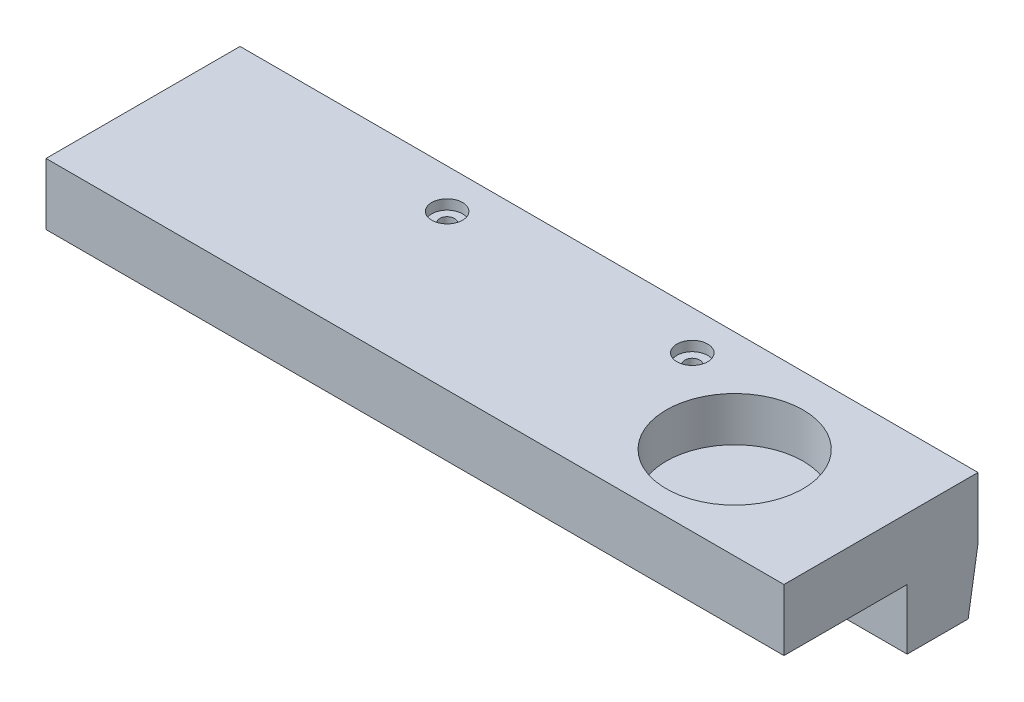
ISO-10303-21;
HEADER;
FILE_DESCRIPTION(('STEP AP214'),'2;1');
FILE_NAME('part.step','',(''),(''),'','','');
FILE_SCHEMA(('AUTOMOTIVE_DESIGN { 1 0 10303 214 1 1 1 1 }'));
ENDSEC;
DATA;
#1=APPLICATION_CONTEXT('core data for automotive mechanical design processes');
#2=APPLICATION_PROTOCOL_DEFINITION('international standard','automotive_design',2000,#1);
#3=PRODUCT_CONTEXT('',#1,'mechanical');
#4=PRODUCT('Part','Part','',(#3));
#5=PRODUCT_RELATED_PRODUCT_CATEGORY('part','',(#4));
#6=PRODUCT_DEFINITION_FORMATION('','',#4);
#7=PRODUCT_DEFINITION_CONTEXT('part definition',#1,'design');
#8=PRODUCT_DEFINITION('design','',#6,#7);
#9=PRODUCT_DEFINITION_SHAPE('','',#8);
#10=(LENGTH_UNIT() NAMED_UNIT(*) SI_UNIT(.MILLI.,.METRE.));
#11=(NAMED_UNIT(*) PLANE_ANGLE_UNIT() SI_UNIT($,.RADIAN.));
#12=(NAMED_UNIT(*) SI_UNIT($,.STERADIAN.) SOLID_ANGLE_UNIT());
#13=UNCERTAINTY_MEASURE_WITH_UNIT(LENGTH_MEASURE(1.E-05),#10,'distance_accuracy_value','');
#14=(GEOMETRIC_REPRESENTATION_CONTEXT(3) GLOBAL_UNCERTAINTY_ASSIGNED_CONTEXT((#13)) GLOBAL_UNIT_ASSIGNED_CONTEXT((#10,
#11,#12)) REPRESENTATION_CONTEXT('',''));
#15=CARTESIAN_POINT('',(0.,0.,0.));
#16=DIRECTION('',(0.,0.,1.));
#17=DIRECTION('',(1.,0.,0.));
#18=AXIS2_PLACEMENT_3D('',#15,#16,#17);
#19=CARTESIAN_POINT('',(-58.3066322296311,-28.9751506024097,30.));
#20=DIRECTION('',(0.,-1.,0.));
#21=DIRECTION('',(0.,0.,1.));
#22=AXIS2_PLACEMENT_3D('',#19,#20,#21);
#23=PLANE('',#22);
#24=DIRECTION('',(1.,0.,0.));
#25=VECTOR('',#24,1.);
#26=CARTESIAN_POINT('',(-58.3066322296311,-28.9751506024097,10.));
#27=LINE('',#26,#25);
#28=CARTESIAN_POINT('',(-58.3066322296311,-28.9751506024097,10.));
#29=VERTEX_POINT('',#28);
#30=CARTESIAN_POINT('',(61.4933677703689,-28.9751506024097,10.));
#31=VERTEX_POINT('',#30);
#32=EDGE_CURVE('E146',#29,#31,#27,.T.);
#33=ORIENTED_EDGE('',*,*,#32,.T.);
#34=DIRECTION('',(0.,0.,-1.));
#35=VECTOR('',#34,1.);
#36=CARTESIAN_POINT('',(61.4933677703689,-28.9751506024097,30.));
#37=LINE('',#36,#35);
#38=CARTESIAN_POINT('',(61.4933677703689,-28.9751506024097,30.));
#39=VERTEX_POINT('',#38);
#40=EDGE_CURVE('E127',#39,#31,#37,.T.);
#41=ORIENTED_EDGE('',*,*,#40,.F.);
#42=DIRECTION('',(1.,0.,0.));
#43=VECTOR('',#42,1.);
#44=CARTESIAN_POINT('',(-58.3066322296311,-28.9751506024097,30.));
#45=LINE('',#44,#43);
#46=CARTESIAN_POINT('',(-58.3066322296311,-28.9751506024097,30.));
#47=VERTEX_POINT('',#46);
#48=EDGE_CURVE('E139',#47,#39,#45,.T.);
#49=ORIENTED_EDGE('',*,*,#48,.F.);
#50=DIRECTION('',(0.,0.,-1.));
#51=VECTOR('',#50,1.);
#52=CARTESIAN_POINT('',(-58.3066322296311,-28.9751506024097,30.));
#53=LINE('',#52,#51);
#54=EDGE_CURVE('E52',#47,#29,#53,.T.);
#55=ORIENTED_EDGE('',*,*,#54,.T.);
#56=EDGE_LOOP('',(#33,#41,#49,#55));
#57=FACE_BOUND('',#56,.T.);
#58=ADVANCED_FACE('F45',(#57),#23,.T.);
#59=CARTESIAN_POINT('',(-58.3066322296311,-28.9751506024097,30.));
#60=DIRECTION('',(1.,0.,0.));
#61=DIRECTION('',(0.,-1.,0.));
#62=AXIS2_PLACEMENT_3D('',#59,#60,#61);
#63=PLANE('',#62);
#64=DIRECTION('',(0.,-1.,0.));
#65=VECTOR('',#64,1.);
#66=CARTESIAN_POINT('',(-58.3066322296311,-28.9751506024097,-1.5));
#67=LINE('',#66,#65);
#68=CARTESIAN_POINT('',(-58.3066322296311,-18.9751506024097,-1.5));
#69=VERTEX_POINT('',#68);
#70=CARTESIAN_POINT('',(-58.3066322296311,-28.9751506024097,-1.5));
#71=VERTEX_POINT('',#70);
#72=EDGE_CURVE('E119',#69,#71,#67,.T.);
#73=ORIENTED_EDGE('',*,*,#72,.T.);
#74=DIRECTION('',(0.,0.986989017415999,-0.160787684541453));
#75=VECTOR('',#74,1.);
#76=CARTESIAN_POINT('',(-58.3066322296311,-33.9740644839218,-0.685640595743636));
#77=LINE('',#76,#75);
#78=CARTESIAN_POINT('',(-58.3066322296311,-38.7751506024097,0.0964912280701766));
#79=VERTEX_POINT('',#78);
#80=EDGE_CURVE('E182',#79,#71,#77,.T.);
#81=ORIENTED_EDGE('',*,*,#80,.F.);
#82=DIRECTION('',(0.,0.,1.));
#83=VECTOR('',#82,1.);
#84=CARTESIAN_POINT('',(-58.3066322296311,-38.7751506024097,0.));
#85=LINE('',#84,#83);
#86=CARTESIAN_POINT('',(-58.3066322296311,-38.7751506024097,10.));
#87=VERTEX_POINT('',#86);
#88=EDGE_CURVE('E149',#79,#87,#85,.T.);
#89=ORIENTED_EDGE('',*,*,#88,.T.);
#90=DIRECTION('',(0.,1.,0.));
#91=VECTOR('',#90,1.);
#92=CARTESIAN_POINT('',(-58.3066322296311,-38.7751506024097,10.));
#93=LINE('',#92,#91);
#94=EDGE_CURVE('E65',#87,#29,#93,.T.);
#95=ORIENTED_EDGE('',*,*,#94,.T.);
#96=ORIENTED_EDGE('',*,*,#54,.F.);
#97=DIRECTION('',(0.,1.,0.));
#98=VECTOR('',#97,1.);
#99=CARTESIAN_POINT('',(-58.3066322296311,-28.9751506024097,30.));
#100=LINE('',#99,#98);
#101=CARTESIAN_POINT('',(-58.3066322296311,-18.9751506024097,30.));
#102=VERTEX_POINT('',#101);
#103=EDGE_CURVE('E131',#47,#102,#100,.T.);
#104=ORIENTED_EDGE('',*,*,#103,.T.);
#105=DIRECTION('',(0.,0.,-1.));
#106=VECTOR('',#105,1.);
#107=CARTESIAN_POINT('',(-58.3066322296311,-18.9751506024097,30.));
#108=LINE('',#107,#106);
#109=EDGE_CURVE('E126',#102,#69,#108,.T.);
#110=ORIENTED_EDGE('',*,*,#109,.T.);
#111=EDGE_LOOP('',(#73,#81,#89,#95,#96,#104,#110));
#112=FACE_BOUND('',#111,.T.);
#113=ADVANCED_FACE('F190',(#112),#63,.F.);
#114=CARTESIAN_POINT('',(-58.3066322296311,-18.9751506024097,30.));
#115=DIRECTION('',(0.,-1.,0.));
#116=DIRECTION('',(0.,0.,1.));
#117=AXIS2_PLACEMENT_3D('',#114,#115,#116);
#118=PLANE('',#117);
#119=CARTESIAN_POINT('',(38.4933677703689,-18.9751506024097,15.));
#120=DIRECTION('',(0.,-1.,0.));
#121=DIRECTION('',(0.,0.,-1.));
#122=AXIS2_PLACEMENT_3D('',#119,#120,#121);
#123=CIRCLE('',#122,11.1);
#124=CARTESIAN_POINT('',(38.4933677703689,-18.9751506024097,3.9));
#125=VERTEX_POINT('',#124);
#126=EDGE_CURVE('E179',#125,#125,#123,.T.);
#127=ORIENTED_EDGE('',*,*,#126,.T.);
#128=EDGE_LOOP('',(#127));
#129=FACE_BOUND('',#128,.T.);
#130=CARTESIAN_POINT('',(21.4933677703689,-18.9751506024097,4.88));
#131=DIRECTION('',(0.,-1.,0.));
#132=DIRECTION('',(0.,0.,-1.));
#133=AXIS2_PLACEMENT_3D('',#130,#131,#132);
#134=CIRCLE('',#133,2.5);
#135=CARTESIAN_POINT('',(21.4933677703689,-18.9751506024097,2.38));
#136=VERTEX_POINT('',#135);
#137=EDGE_CURVE('E175',#136,#136,#134,.T.);
#138=ORIENTED_EDGE('',*,*,#137,.T.);
#139=EDGE_LOOP('',(#138));
#140=FACE_BOUND('',#139,.T.);
#141=CARTESIAN_POINT('',(-18.3066322296311,-18.9751506024097,4.88));
#142=DIRECTION('',(0.,-1.,0.));
#143=DIRECTION('',(0.,0.,-1.));
#144=AXIS2_PLACEMENT_3D('',#141,#142,#143);
#145=CIRCLE('',#144,2.5);
#146=CARTESIAN_POINT('',(-18.3066322296311,-18.9751506024097,2.38000000000001));
#147=VERTEX_POINT('',#146);
#148=EDGE_CURVE('E163',#147,#147,#145,.T.);
#149=ORIENTED_EDGE('',*,*,#148,.T.);
#150=EDGE_LOOP('',(#149));
#151=FACE_BOUND('',#150,.T.);
#152=ORIENTED_EDGE('',*,*,#109,.F.);
#153=DIRECTION('',(1.,0.,0.));
#154=VECTOR('',#153,1.);
#155=CARTESIAN_POINT('',(-58.3066322296311,-18.9751506024097,30.));
#156=LINE('',#155,#154);
#157=CARTESIAN_POINT('',(61.4933677703689,-18.9751506024097,30.));
#158=VERTEX_POINT('',#157);
#159=EDGE_CURVE('E125',#102,#158,#156,.T.);
#160=ORIENTED_EDGE('',*,*,#159,.T.);
#161=DIRECTION('',(0.,0.,-1.));
#162=VECTOR('',#161,1.);
#163=CARTESIAN_POINT('',(61.4933677703689,-18.9751506024097,30.));
#164=LINE('',#163,#162);
#165=CARTESIAN_POINT('',(61.4933677703689,-18.9751506024097,-1.5));
#166=VERTEX_POINT('',#165);
#167=EDGE_CURVE('E109',#158,#166,#164,.T.);
#168=ORIENTED_EDGE('',*,*,#167,.T.);
#169=DIRECTION('',(-1.,0.,0.));
#170=VECTOR('',#169,1.);
#171=CARTESIAN_POINT('',(61.4933677703689,-18.9751506024097,-1.5));
#172=LINE('',#171,#170);
#173=EDGE_CURVE('E114',#166,#69,#172,.T.);
#174=ORIENTED_EDGE('',*,*,#173,.T.);
#175=EDGE_LOOP('',(#152,#160,#168,#174));
#176=FACE_BOUND('',#175,.T.);
#177=ADVANCED_FACE('F124',(#129,#140,#151,#176),#118,.F.);
#178=CARTESIAN_POINT('',(61.4933677703689,-28.9751506024097,30.));
#179=DIRECTION('',(1.,0.,0.));
#180=DIRECTION('',(0.,0.,-1.));
#181=AXIS2_PLACEMENT_3D('',#178,#179,#180);
#182=PLANE('',#181);
#183=ORIENTED_EDGE('',*,*,#167,.F.);
#184=DIRECTION('',(0.,1.,0.));
#185=VECTOR('',#184,1.);
#186=CARTESIAN_POINT('',(61.4933677703689,-28.9751506024097,30.));
#187=LINE('',#186,#185);
#188=EDGE_CURVE('E137',#39,#158,#187,.T.);
#189=ORIENTED_EDGE('',*,*,#188,.F.);
#190=ORIENTED_EDGE('',*,*,#40,.T.);
#191=DIRECTION('',(0.,1.,0.));
#192=VECTOR('',#191,1.);
#193=CARTESIAN_POINT('',(61.4933677703689,-38.7751506024097,10.));
#194=LINE('',#193,#192);
#195=CARTESIAN_POINT('',(61.4933677703689,-38.7751506024097,10.));
#196=VERTEX_POINT('',#195);
#197=EDGE_CURVE('E143',#196,#31,#194,.T.);
#198=ORIENTED_EDGE('',*,*,#197,.F.);
#199=DIRECTION('',(0.,0.,-1.));
#200=VECTOR('',#199,1.);
#201=CARTESIAN_POINT('',(61.4933677703689,-38.7751506024097,0.));
#202=LINE('',#201,#200);
#203=CARTESIAN_POINT('',(61.4933677703689,-38.7751506024097,0.0964912280701786));
#204=VERTEX_POINT('',#203);
#205=EDGE_CURVE('E145',#196,#204,#202,.T.);
#206=ORIENTED_EDGE('',*,*,#205,.T.);
#207=DIRECTION('',(0.,0.986989017415999,-0.160787684541453));
#208=VECTOR('',#207,1.);
#209=CARTESIAN_POINT('',(61.4933677703689,1.98372710949531,-6.54342619366873));
#210=LINE('',#209,#208);
#211=CARTESIAN_POINT('',(61.4933677703689,-28.9751506024097,-1.5));
#212=VERTEX_POINT('',#211);
#213=EDGE_CURVE('E112',#204,#212,#210,.T.);
#214=ORIENTED_EDGE('',*,*,#213,.T.);
#215=DIRECTION('',(0.,1.,0.));
#216=VECTOR('',#215,1.);
#217=CARTESIAN_POINT('',(61.4933677703689,-28.9751506024097,-1.5));
#218=LINE('',#217,#216);
#219=EDGE_CURVE('E105',#212,#166,#218,.T.);
#220=ORIENTED_EDGE('',*,*,#219,.T.);
#221=EDGE_LOOP('',(#183,#189,#190,#198,#206,#214,#220));
#222=FACE_BOUND('',#221,.T.);
#223=ADVANCED_FACE('F107',(#222),#182,.T.);
#224=CARTESIAN_POINT('',(0.,3.0496987951807,30.));
#225=DIRECTION('',(0.,0.,-1.));
#226=DIRECTION('',(-1.,0.,0.));
#227=AXIS2_PLACEMENT_3D('',#224,#225,#226);
#228=PLANE('',#227);
#229=ORIENTED_EDGE('',*,*,#48,.T.);
#230=ORIENTED_EDGE('',*,*,#188,.T.);
#231=ORIENTED_EDGE('',*,*,#159,.F.);
#232=ORIENTED_EDGE('',*,*,#103,.F.);
#233=EDGE_LOOP('',(#229,#230,#231,#232));
#234=FACE_BOUND('',#233,.T.);
#235=ADVANCED_FACE('F193',(#234),#228,.F.);
#236=CARTESIAN_POINT('',(-58.3066322296311,-38.7751506024097,10.));
#237=DIRECTION('',(0.,0.,-1.));
#238=DIRECTION('',(-1.,0.,0.));
#239=AXIS2_PLACEMENT_3D('',#236,#237,#238);
#240=PLANE('',#239);
#241=ORIENTED_EDGE('',*,*,#32,.F.);
#242=ORIENTED_EDGE('',*,*,#94,.F.);
#243=DIRECTION('',(1.,0.,0.));
#244=VECTOR('',#243,1.);
#245=CARTESIAN_POINT('',(-58.3066322296311,-38.7751506024097,10.));
#246=LINE('',#245,#244);
#247=EDGE_CURVE('E152',#87,#196,#246,.T.);
#248=ORIENTED_EDGE('',*,*,#247,.T.);
#249=ORIENTED_EDGE('',*,*,#197,.T.);
#250=EDGE_LOOP('',(#241,#242,#248,#249));
#251=FACE_BOUND('',#250,.T.);
#252=ADVANCED_FACE('F199',(#251),#240,.F.);
#253=CARTESIAN_POINT('',(0.,-38.7751506024097,0.));
#254=DIRECTION('',(0.,-1.,0.));
#255=DIRECTION('',(0.,0.,1.));
#256=AXIS2_PLACEMENT_3D('',#253,#254,#255);
#257=PLANE('',#256);
#258=DIRECTION('',(1.,0.,0.));
#259=VECTOR('',#258,1.);
#260=CARTESIAN_POINT('',(0.,-38.7751506024097,0.0964912280701766));
#261=LINE('',#260,#259);
#262=EDGE_CURVE('E11',#79,#204,#261,.T.);
#263=ORIENTED_EDGE('',*,*,#262,.T.);
#264=ORIENTED_EDGE('',*,*,#205,.F.);
#265=ORIENTED_EDGE('',*,*,#247,.F.);
#266=ORIENTED_EDGE('',*,*,#88,.F.);
#267=EDGE_LOOP('',(#263,#264,#265,#266));
#268=FACE_BOUND('',#267,.T.);
#269=CARTESIAN_POINT('',(21.4933677703689,-38.7751506024097,4.88));
#270=DIRECTION('',(0.,-1.,0.));
#271=DIRECTION('',(0.,0.,-1.));
#272=AXIS2_PLACEMENT_3D('',#269,#270,#271);
#273=CIRCLE('',#272,1.19999999999999);
#274=CARTESIAN_POINT('',(21.4933677703689,-38.7751506024097,3.68000000000001));
#275=VERTEX_POINT('',#274);
#276=EDGE_CURVE('E166',#275,#275,#273,.T.);
#277=ORIENTED_EDGE('',*,*,#276,.F.);
#278=EDGE_LOOP('',(#277));
#279=FACE_BOUND('',#278,.T.);
#280=CARTESIAN_POINT('',(-18.3066322296311,-38.7751506024097,4.88));
#281=DIRECTION('',(0.,-1.,0.));
#282=DIRECTION('',(0.,0.,-1.));
#283=AXIS2_PLACEMENT_3D('',#280,#281,#282);
#284=CIRCLE('',#283,1.19999999999999);
#285=CARTESIAN_POINT('',(-18.3066322296311,-38.7751506024097,3.68000000000001));
#286=VERTEX_POINT('',#285);
#287=EDGE_CURVE('E150',#286,#286,#284,.T.);
#288=ORIENTED_EDGE('',*,*,#287,.F.);
#289=EDGE_LOOP('',(#288));
#290=FACE_BOUND('',#289,.T.);
#291=ADVANCED_FACE('F202',(#268,#279,#290),#257,.T.);
#292=CARTESIAN_POINT('',(-18.3066322296311,-18.9751506024097,4.88));
#293=DIRECTION('',(0.,1.,0.));
#294=DIRECTION('',(0.,0.,-1.));
#295=AXIS2_PLACEMENT_3D('',#292,#293,#294);
#296=CYLINDRICAL_SURFACE('',#295,1.2);
#297=ORIENTED_EDGE('',*,*,#287,.T.);
#298=EDGE_LOOP('',(#297));
#299=FACE_BOUND('',#298,.T.);
#300=CARTESIAN_POINT('',(-18.3066322296311,-20.5751506024097,4.88));
#301=DIRECTION('',(0.,-1.,0.));
#302=DIRECTION('',(0.,0.,-1.));
#303=AXIS2_PLACEMENT_3D('',#300,#301,#302);
#304=CIRCLE('',#303,1.20000000000001);
#305=CARTESIAN_POINT('',(-18.3066322296311,-20.5751506024097,3.67999999999999));
#306=VERTEX_POINT('',#305);
#307=EDGE_CURVE('E157',#306,#306,#304,.T.);
#308=ORIENTED_EDGE('',*,*,#307,.F.);
#309=EDGE_LOOP('',(#308));
#310=FACE_BOUND('',#309,.T.);
#311=ADVANCED_FACE('F238',(#299,#310),#296,.F.);
#312=CARTESIAN_POINT('',(-17.1066322296311,-20.5751506024097,4.88));
#313=DIRECTION('',(0.,-1.,0.));
#314=DIRECTION('',(0.,0.,1.));
#315=AXIS2_PLACEMENT_3D('',#312,#313,#314);
#316=PLANE('',#315);
#317=ORIENTED_EDGE('',*,*,#307,.T.);
#318=EDGE_LOOP('',(#317));
#319=FACE_BOUND('',#318,.T.);
#320=CARTESIAN_POINT('',(-18.3066322296311,-20.5751506024097,4.88));
#321=DIRECTION('',(0.,-1.,0.));
#322=DIRECTION('',(0.,0.,-1.));
#323=AXIS2_PLACEMENT_3D('',#320,#321,#322);
#324=CIRCLE('',#323,2.5);
#325=CARTESIAN_POINT('',(-18.3066322296311,-20.5751506024097,2.38000000000001));
#326=VERTEX_POINT('',#325);
#327=EDGE_CURVE('E160',#326,#326,#324,.T.);
#328=ORIENTED_EDGE('',*,*,#327,.F.);
#329=EDGE_LOOP('',(#328));
#330=FACE_BOUND('',#329,.T.);
#331=ADVANCED_FACE('F243',(#319,#330),#316,.F.);
#332=CARTESIAN_POINT('',(-18.3066322296311,-18.9751506024097,4.88));
#333=DIRECTION('',(0.,1.,0.));
#334=DIRECTION('',(0.,0.,-1.));
#335=AXIS2_PLACEMENT_3D('',#332,#333,#334);
#336=CYLINDRICAL_SURFACE('',#335,2.5);
#337=ORIENTED_EDGE('',*,*,#327,.T.);
#338=EDGE_LOOP('',(#337));
#339=FACE_BOUND('',#338,.T.);
#340=ORIENTED_EDGE('',*,*,#148,.F.);
#341=EDGE_LOOP('',(#340));
#342=FACE_BOUND('',#341,.T.);
#343=ADVANCED_FACE('F247',(#339,#342),#336,.F.);
#344=CARTESIAN_POINT('',(21.4933677703689,-18.9751506024097,4.88));
#345=DIRECTION('',(0.,1.,0.));
#346=DIRECTION('',(0.,0.,-1.));
#347=AXIS2_PLACEMENT_3D('',#344,#345,#346);
#348=CYLINDRICAL_SURFACE('',#347,1.2);
#349=ORIENTED_EDGE('',*,*,#276,.T.);
#350=EDGE_LOOP('',(#349));
#351=FACE_BOUND('',#350,.T.);
#352=CARTESIAN_POINT('',(21.4933677703689,-20.5751506024097,4.88));
#353=DIRECTION('',(0.,-1.,0.));
#354=DIRECTION('',(0.,0.,-1.));
#355=AXIS2_PLACEMENT_3D('',#352,#353,#354);
#356=CIRCLE('',#355,1.20000000000001);
#357=CARTESIAN_POINT('',(21.4933677703689,-20.5751506024097,3.67999999999999));
#358=VERTEX_POINT('',#357);
#359=EDGE_CURVE('E169',#358,#358,#356,.T.);
#360=ORIENTED_EDGE('',*,*,#359,.F.);
#361=EDGE_LOOP('',(#360));
#362=FACE_BOUND('',#361,.T.);
#363=ADVANCED_FACE('F251',(#351,#362),#348,.F.);
#364=CARTESIAN_POINT('',(22.6933677703689,-20.5751506024097,4.88));
#365=DIRECTION('',(0.,-1.,0.));
#366=DIRECTION('',(0.,0.,1.));
#367=AXIS2_PLACEMENT_3D('',#364,#365,#366);
#368=PLANE('',#367);
#369=ORIENTED_EDGE('',*,*,#359,.T.);
#370=EDGE_LOOP('',(#369));
#371=FACE_BOUND('',#370,.T.);
#372=CARTESIAN_POINT('',(21.4933677703689,-20.5751506024097,4.88));
#373=DIRECTION('',(0.,-1.,0.));
#374=DIRECTION('',(0.,0.,-1.));
#375=AXIS2_PLACEMENT_3D('',#372,#373,#374);
#376=CIRCLE('',#375,2.5);
#377=CARTESIAN_POINT('',(21.4933677703689,-20.5751506024097,2.38));
#378=VERTEX_POINT('',#377);
#379=EDGE_CURVE('E172',#378,#378,#376,.T.);
#380=ORIENTED_EDGE('',*,*,#379,.F.);
#381=EDGE_LOOP('',(#380));
#382=FACE_BOUND('',#381,.T.);
#383=ADVANCED_FACE('F255',(#371,#382),#368,.F.);
#384=CARTESIAN_POINT('',(21.4933677703689,-18.9751506024097,4.88));
#385=DIRECTION('',(0.,1.,0.));
#386=DIRECTION('',(0.,0.,-1.));
#387=AXIS2_PLACEMENT_3D('',#384,#385,#386);
#388=CYLINDRICAL_SURFACE('',#387,2.5);
#389=ORIENTED_EDGE('',*,*,#379,.T.);
#390=EDGE_LOOP('',(#389));
#391=FACE_BOUND('',#390,.T.);
#392=ORIENTED_EDGE('',*,*,#137,.F.);
#393=EDGE_LOOP('',(#392));
#394=FACE_BOUND('',#393,.T.);
#395=ADVANCED_FACE('F259',(#391,#394),#388,.F.);
#396=CARTESIAN_POINT('',(38.4933677703689,-26.1751506024097,15.));
#397=DIRECTION('',(0.,1.,0.));
#398=DIRECTION('',(0.,0.,-1.));
#399=AXIS2_PLACEMENT_3D('',#396,#397,#398);
#400=CYLINDRICAL_SURFACE('',#399,11.1);
#401=CARTESIAN_POINT('',(38.4933677703689,-26.1751506024097,15.));
#402=DIRECTION('',(0.,-1.,0.));
#403=DIRECTION('',(0.,0.,-1.));
#404=AXIS2_PLACEMENT_3D('',#401,#402,#403);
#405=CIRCLE('',#404,11.1);
#406=CARTESIAN_POINT('',(38.4933677703689,-26.1751506024097,3.9));
#407=VERTEX_POINT('',#406);
#408=EDGE_CURVE('E178',#407,#407,#405,.T.);
#409=ORIENTED_EDGE('',*,*,#408,.T.);
#410=EDGE_LOOP('',(#409));
#411=FACE_BOUND('',#410,.T.);
#412=ORIENTED_EDGE('',*,*,#126,.F.);
#413=EDGE_LOOP('',(#412));
#414=FACE_BOUND('',#413,.T.);
#415=ADVANCED_FACE('F213',(#411,#414),#400,.F.);
#416=CARTESIAN_POINT('',(38.4933677703689,-26.1751506024097,15.));
#417=DIRECTION('',(0.,1.,0.));
#418=DIRECTION('',(0.,0.,-1.));
#419=AXIS2_PLACEMENT_3D('',#416,#417,#418);
#420=PLANE('',#419);
#421=ORIENTED_EDGE('',*,*,#408,.F.);
#422=EDGE_LOOP('',(#421));
#423=FACE_BOUND('',#422,.T.);
#424=ADVANCED_FACE('F206',(#423),#420,.T.);
#425=CARTESIAN_POINT('',(-63.3066322296311,1.98372710949531,-6.54342619366873));
#426=DIRECTION('',(0.,0.160787684541453,0.986989017415998));
#427=DIRECTION('',(0.,0.986989017415999,-0.160787684541453));
#428=AXIS2_PLACEMENT_3D('',#425,#426,#427);
#429=PLANE('',#428);
#430=ORIENTED_EDGE('',*,*,#262,.F.);
#431=ORIENTED_EDGE('',*,*,#80,.T.);
#432=DIRECTION('',(1.,0.,0.));
#433=VECTOR('',#432,1.);
#434=CARTESIAN_POINT('',(-58.3066322296311,-28.9751506024097,-1.5));
#435=LINE('',#434,#433);
#436=EDGE_CURVE('E187',#71,#212,#435,.T.);
#437=ORIENTED_EDGE('',*,*,#436,.T.);
#438=ORIENTED_EDGE('',*,*,#213,.F.);
#439=EDGE_LOOP('',(#430,#431,#437,#438));
#440=FACE_BOUND('',#439,.T.);
#441=ADVANCED_FACE('F204',(#440),#429,.F.);
#442=CARTESIAN_POINT('',(0.,3.0496987951807,-1.5));
#443=DIRECTION('',(0.,0.,-1.));
#444=DIRECTION('',(-1.,0.,0.));
#445=AXIS2_PLACEMENT_3D('',#442,#443,#444);
#446=PLANE('',#445);
#447=ORIENTED_EDGE('',*,*,#219,.F.);
#448=ORIENTED_EDGE('',*,*,#436,.F.);
#449=ORIENTED_EDGE('',*,*,#72,.F.);
#450=ORIENTED_EDGE('',*,*,#173,.F.);
#451=EDGE_LOOP('',(#447,#448,#449,#450));
#452=FACE_BOUND('',#451,.T.);
#453=ADVANCED_FACE('F117',(#452),#446,.T.);
#454=CLOSED_SHELL('',(#58,#113,#177,#223,#235,#252,#291,#311,#331,#343,#363,#383,#395,#415,#424,
#441,#453));
#455=MANIFOLD_SOLID_BREP('B2',#454);
#456=ADVANCED_BREP_SHAPE_REPRESENTATION('',(#18,#455),#14);
#457=SHAPE_DEFINITION_REPRESENTATION(#9,#456);
ENDSEC;
END-ISO-10303-21;
